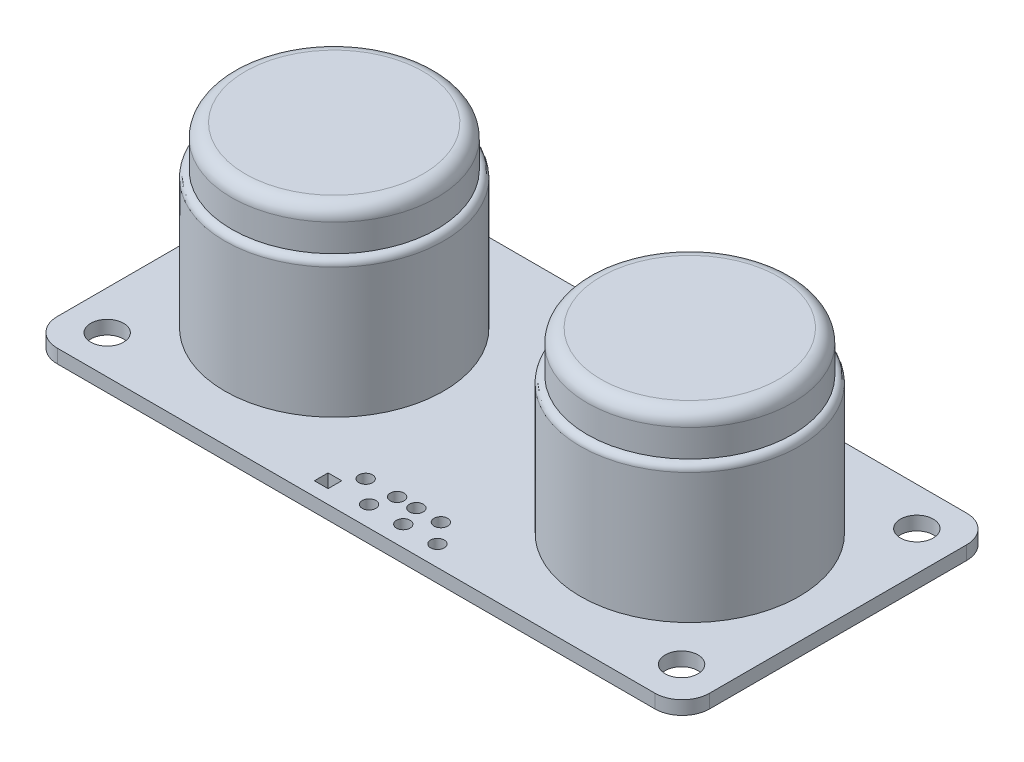
ISO-10303-21;
HEADER;
FILE_DESCRIPTION(('STEP AP214'),'2;1');
FILE_NAME('part.step','',(''),(''),'','','');
FILE_SCHEMA(('AUTOMOTIVE_DESIGN { 1 0 10303 214 1 1 1 1 }'));
ENDSEC;
DATA;
#1=APPLICATION_CONTEXT('core data for automotive mechanical design processes');
#2=APPLICATION_PROTOCOL_DEFINITION('international standard','automotive_design',2000,#1);
#3=PRODUCT_CONTEXT('',#1,'mechanical');
#4=PRODUCT('Part','Part','',(#3));
#5=PRODUCT_RELATED_PRODUCT_CATEGORY('part','',(#4));
#6=PRODUCT_DEFINITION_FORMATION('','',#4);
#7=PRODUCT_DEFINITION_CONTEXT('part definition',#1,'design');
#8=PRODUCT_DEFINITION('design','',#6,#7);
#9=PRODUCT_DEFINITION_SHAPE('','',#8);
#10=(LENGTH_UNIT() NAMED_UNIT(*) SI_UNIT(.MILLI.,.METRE.));
#11=(NAMED_UNIT(*) PLANE_ANGLE_UNIT() SI_UNIT($,.RADIAN.));
#12=(NAMED_UNIT(*) SI_UNIT($,.STERADIAN.) SOLID_ANGLE_UNIT());
#13=UNCERTAINTY_MEASURE_WITH_UNIT(LENGTH_MEASURE(1.E-05),#10,'distance_accuracy_value','');
#14=(GEOMETRIC_REPRESENTATION_CONTEXT(3) GLOBAL_UNCERTAINTY_ASSIGNED_CONTEXT((#13)) GLOBAL_UNIT_ASSIGNED_CONTEXT((#10,
#11,#12)) REPRESENTATION_CONTEXT('',''));
#15=CARTESIAN_POINT('',(0.,0.,0.));
#16=DIRECTION('',(0.,0.,1.));
#17=DIRECTION('',(1.,0.,0.));
#18=AXIS2_PLACEMENT_3D('',#15,#16,#17);
#19=CARTESIAN_POINT('',(0.,1.,0.));
#20=DIRECTION('',(0.,-1.,0.));
#21=DIRECTION('',(0.,0.,-1.));
#22=AXIS2_PLACEMENT_3D('',#19,#20,#21);
#23=PLANE('',#22);
#24=CARTESIAN_POINT('',(-21.,1.,-8.6));
#25=DIRECTION('',(0.,-1.,0.));
#26=DIRECTION('',(0.,0.,-1.));
#27=AXIS2_PLACEMENT_3D('',#24,#25,#26);
#28=CIRCLE('',#27,1.19999999999999);
#29=CARTESIAN_POINT('',(-21.,1.,-9.79999999999999));
#30=VERTEX_POINT('',#29);
#31=EDGE_CURVE('E649',#30,#30,#28,.T.);
#32=ORIENTED_EDGE('',*,*,#31,.T.);
#33=EDGE_LOOP('',(#32));
#34=FACE_BOUND('',#33,.T.);
#35=CARTESIAN_POINT('',(21.,1.,-8.6));
#36=DIRECTION('',(0.,-1.,0.));
#37=DIRECTION('',(0.,0.,-1.));
#38=AXIS2_PLACEMENT_3D('',#35,#36,#37);
#39=CIRCLE('',#38,1.19999999999999);
#40=CARTESIAN_POINT('',(21.,1.,-9.79999999999999));
#41=VERTEX_POINT('',#40);
#42=EDGE_CURVE('E653',#41,#41,#39,.T.);
#43=ORIENTED_EDGE('',*,*,#42,.T.);
#44=EDGE_LOOP('',(#43));
#45=FACE_BOUND('',#44,.T.);
#46=CARTESIAN_POINT('',(21.,1.,8.6));
#47=DIRECTION('',(0.,-1.,0.));
#48=DIRECTION('',(0.,0.,-1.));
#49=AXIS2_PLACEMENT_3D('',#46,#47,#48);
#50=CIRCLE('',#49,1.19999999999999);
#51=CARTESIAN_POINT('',(21.,1.,7.40000000000001));
#52=VERTEX_POINT('',#51);
#53=EDGE_CURVE('E201',#52,#52,#50,.T.);
#54=ORIENTED_EDGE('',*,*,#53,.T.);
#55=EDGE_LOOP('',(#54));
#56=FACE_BOUND('',#55,.T.);
#57=CARTESIAN_POINT('',(-21.,1.,8.6));
#58=DIRECTION('',(0.,-1.,0.));
#59=DIRECTION('',(0.,0.,-1.));
#60=AXIS2_PLACEMENT_3D('',#57,#58,#59);
#61=CIRCLE('',#60,1.19999999999999);
#62=CARTESIAN_POINT('',(-21.,1.,7.40000000000001));
#63=VERTEX_POINT('',#62);
#64=EDGE_CURVE('E663',#63,#63,#61,.T.);
#65=ORIENTED_EDGE('',*,*,#64,.T.);
#66=EDGE_LOOP('',(#65));
#67=FACE_BOUND('',#66,.T.);
#68=CARTESIAN_POINT('',(1.95,1.,9.9));
#69=DIRECTION('',(0.,1.,0.));
#70=DIRECTION('',(0.,0.,1.));
#71=AXIS2_PLACEMENT_3D('',#68,#69,#70);
#72=CIRCLE('',#71,0.499999999999988);
#73=CARTESIAN_POINT('',(1.95,1.,10.4));
#74=VERTEX_POINT('',#73);
#75=EDGE_CURVE('E672',#74,#74,#72,.T.);
#76=ORIENTED_EDGE('',*,*,#75,.F.);
#77=EDGE_LOOP('',(#76));
#78=FACE_BOUND('',#77,.T.);
#79=CARTESIAN_POINT('',(4.45,1.,9.9));
#80=DIRECTION('',(0.,1.,0.));
#81=DIRECTION('',(0.,0.,1.));
#82=AXIS2_PLACEMENT_3D('',#79,#80,#81);
#83=CIRCLE('',#82,0.499999999999988);
#84=CARTESIAN_POINT('',(4.45,1.,10.4));
#85=VERTEX_POINT('',#84);
#86=EDGE_CURVE('E678',#85,#85,#83,.T.);
#87=ORIENTED_EDGE('',*,*,#86,.F.);
#88=EDGE_LOOP('',(#87));
#89=FACE_BOUND('',#88,.T.);
#90=CARTESIAN_POINT('',(0.,1.,8.4));
#91=DIRECTION('',(0.,1.,0.));
#92=DIRECTION('',(0.,0.,1.));
#93=AXIS2_PLACEMENT_3D('',#90,#91,#92);
#94=CIRCLE('',#93,0.499999999999988);
#95=CARTESIAN_POINT('',(0.,1.,8.89999999999999));
#96=VERTEX_POINT('',#95);
#97=EDGE_CURVE('E690',#96,#96,#94,.T.);
#98=ORIENTED_EDGE('',*,*,#97,.F.);
#99=EDGE_LOOP('',(#98));
#100=FACE_BOUND('',#99,.T.);
#101=CARTESIAN_POINT('',(3.2,1.,8.4));
#102=DIRECTION('',(0.,1.,0.));
#103=DIRECTION('',(0.,0.,1.));
#104=AXIS2_PLACEMENT_3D('',#101,#102,#103);
#105=CIRCLE('',#104,0.499999999999988);
#106=CARTESIAN_POINT('',(3.2,1.,8.89999999999999));
#107=VERTEX_POINT('',#106);
#108=EDGE_CURVE('E696',#107,#107,#105,.T.);
#109=ORIENTED_EDGE('',*,*,#108,.F.);
#110=EDGE_LOOP('',(#109));
#111=FACE_BOUND('',#110,.T.);
#112=CARTESIAN_POINT('',(1.407287445354,1.,8.4));
#113=DIRECTION('',(0.,1.,0.));
#114=DIRECTION('',(0.,0.,1.));
#115=AXIS2_PLACEMENT_3D('',#112,#113,#114);
#116=CIRCLE('',#115,0.499999999999988);
#117=CARTESIAN_POINT('',(1.407287445354,1.,8.89999999999999));
#118=VERTEX_POINT('',#117);
#119=EDGE_CURVE('E702',#118,#118,#116,.T.);
#120=ORIENTED_EDGE('',*,*,#119,.F.);
#121=EDGE_LOOP('',(#120));
#122=FACE_BOUND('',#121,.T.);
#123=CARTESIAN_POINT('',(-13.,1.,0.));
#124=DIRECTION('',(0.,1.,0.));
#125=DIRECTION('',(0.,0.,1.));
#126=AXIS2_PLACEMENT_3D('',#123,#124,#125);
#127=CIRCLE('',#126,8.);
#128=CARTESIAN_POINT('',(-13.,1.,8.));
#129=VERTEX_POINT('',#128);
#130=EDGE_CURVE('E714',#129,#129,#127,.T.);
#131=ORIENTED_EDGE('',*,*,#130,.F.);
#132=EDGE_LOOP('',(#131));
#133=FACE_BOUND('',#132,.T.);
#134=CARTESIAN_POINT('',(13.,1.,0.));
#135=DIRECTION('',(0.,1.,0.));
#136=DIRECTION('',(0.,0.,1.));
#137=AXIS2_PLACEMENT_3D('',#134,#135,#136);
#138=CIRCLE('',#137,8.);
#139=CARTESIAN_POINT('',(13.,1.,8.));
#140=VERTEX_POINT('',#139);
#141=EDGE_CURVE('E162',#140,#140,#138,.T.);
#142=ORIENTED_EDGE('',*,*,#141,.F.);
#143=EDGE_LOOP('',(#142));
#144=FACE_BOUND('',#143,.T.);
#145=DIRECTION('',(0.,0.,1.));
#146=VECTOR('',#145,1.);
#147=CARTESIAN_POINT('',(-4.05,1.,9.4));
#148=LINE('',#147,#146);
#149=CARTESIAN_POINT('',(-4.05,1.,9.4));
#150=VERTEX_POINT('',#149);
#151=CARTESIAN_POINT('',(-4.05,1.,10.4));
#152=VERTEX_POINT('',#151);
#153=EDGE_CURVE('E168',#150,#152,#148,.T.);
#154=ORIENTED_EDGE('',*,*,#153,.F.);
#155=DIRECTION('',(-1.,0.,0.));
#156=VECTOR('',#155,1.);
#157=CARTESIAN_POINT('',(-3.05,1.,9.4));
#158=LINE('',#157,#156);
#159=CARTESIAN_POINT('',(-3.05,1.,9.4));
#160=VERTEX_POINT('',#159);
#161=EDGE_CURVE('E138',#160,#150,#158,.T.);
#162=ORIENTED_EDGE('',*,*,#161,.F.);
#163=DIRECTION('',(0.,0.,-1.));
#164=VECTOR('',#163,1.);
#165=CARTESIAN_POINT('',(-3.05,1.,10.4));
#166=LINE('',#165,#164);
#167=CARTESIAN_POINT('',(-3.05,1.,10.4));
#168=VERTEX_POINT('',#167);
#169=EDGE_CURVE('E156',#168,#160,#166,.T.);
#170=ORIENTED_EDGE('',*,*,#169,.F.);
#171=DIRECTION('',(1.,0.,0.));
#172=VECTOR('',#171,1.);
#173=CARTESIAN_POINT('',(-4.05,1.,10.4));
#174=LINE('',#173,#172);
#175=EDGE_CURVE('E159',#152,#168,#174,.T.);
#176=ORIENTED_EDGE('',*,*,#175,.F.);
#177=EDGE_LOOP('',(#154,#162,#170,#176));
#178=FACE_BOUND('',#177,.T.);
#179=DIRECTION('',(1.,0.,0.));
#180=VECTOR('',#179,1.);
#181=CARTESIAN_POINT('',(-23.85,1.,-11.4));
#182=LINE('',#181,#180);
#183=CARTESIAN_POINT('',(-21.85,1.,-11.4));
#184=VERTEX_POINT('',#183);
#185=CARTESIAN_POINT('',(21.85,1.,-11.4));
#186=VERTEX_POINT('',#185);
#187=EDGE_CURVE('E181',#184,#186,#182,.T.);
#188=ORIENTED_EDGE('',*,*,#187,.F.);
#189=CARTESIAN_POINT('',(-21.85,1.,-9.4));
#190=DIRECTION('',(0.,-1.,0.));
#191=DIRECTION('',(0.,0.,-1.));
#192=AXIS2_PLACEMENT_3D('',#189,#190,#191);
#193=CIRCLE('',#192,2.);
#194=CARTESIAN_POINT('',(-23.85,1.,-9.4));
#195=VERTEX_POINT('',#194);
#196=EDGE_CURVE('E240',#184,#195,#193,.F.);
#197=ORIENTED_EDGE('',*,*,#196,.T.);
#198=DIRECTION('',(0.,0.,-1.));
#199=VECTOR('',#198,1.);
#200=CARTESIAN_POINT('',(-23.85,1.,11.4));
#201=LINE('',#200,#199);
#202=CARTESIAN_POINT('',(-23.85,1.,9.4));
#203=VERTEX_POINT('',#202);
#204=EDGE_CURVE('E178',#203,#195,#201,.T.);
#205=ORIENTED_EDGE('',*,*,#204,.F.);
#206=CARTESIAN_POINT('',(-21.85,1.,9.4));
#207=DIRECTION('',(0.,-1.,0.));
#208=DIRECTION('',(0.,0.,-1.));
#209=AXIS2_PLACEMENT_3D('',#206,#207,#208);
#210=CIRCLE('',#209,2.);
#211=CARTESIAN_POINT('',(-21.85,1.,11.4));
#212=VERTEX_POINT('',#211);
#213=EDGE_CURVE('E235',#203,#212,#210,.F.);
#214=ORIENTED_EDGE('',*,*,#213,.T.);
#215=DIRECTION('',(-1.,0.,0.));
#216=VECTOR('',#215,1.);
#217=CARTESIAN_POINT('',(23.85,1.,11.4));
#218=LINE('',#217,#216);
#219=CARTESIAN_POINT('',(21.85,1.,11.4));
#220=VERTEX_POINT('',#219);
#221=EDGE_CURVE('E187',#220,#212,#218,.T.);
#222=ORIENTED_EDGE('',*,*,#221,.F.);
#223=CARTESIAN_POINT('',(21.85,1.,9.4));
#224=DIRECTION('',(0.,-1.,0.));
#225=DIRECTION('',(0.,0.,-1.));
#226=AXIS2_PLACEMENT_3D('',#223,#224,#225);
#227=CIRCLE('',#226,2.);
#228=CARTESIAN_POINT('',(23.85,1.,9.4));
#229=VERTEX_POINT('',#228);
#230=EDGE_CURVE('E56',#220,#229,#227,.F.);
#231=ORIENTED_EDGE('',*,*,#230,.T.);
#232=DIRECTION('',(0.,0.,1.));
#233=VECTOR('',#232,1.);
#234=CARTESIAN_POINT('',(23.85,1.,-11.4));
#235=LINE('',#234,#233);
#236=CARTESIAN_POINT('',(23.85,1.,-9.4));
#237=VERTEX_POINT('',#236);
#238=EDGE_CURVE('E185',#237,#229,#235,.T.);
#239=ORIENTED_EDGE('',*,*,#238,.F.);
#240=CARTESIAN_POINT('',(21.85,1.,-9.4));
#241=DIRECTION('',(0.,-1.,0.));
#242=DIRECTION('',(0.,0.,-1.));
#243=AXIS2_PLACEMENT_3D('',#240,#241,#242);
#244=CIRCLE('',#243,2.);
#245=EDGE_CURVE('E237',#237,#186,#244,.F.);
#246=ORIENTED_EDGE('',*,*,#245,.T.);
#247=EDGE_LOOP('',(#188,#197,#205,#214,#222,#231,#239,#246));
#248=FACE_BOUND('',#247,.T.);
#249=CARTESIAN_POINT('',(-2.3,1.,8.4));
#250=DIRECTION('',(0.,1.,0.));
#251=DIRECTION('',(0.,0.,1.));
#252=AXIS2_PLACEMENT_3D('',#249,#250,#251);
#253=CIRCLE('',#252,0.499999999999988);
#254=CARTESIAN_POINT('',(-2.3,1.,8.89999999999999));
#255=VERTEX_POINT('',#254);
#256=EDGE_CURVE('E684',#255,#255,#253,.T.);
#257=ORIENTED_EDGE('',*,*,#256,.F.);
#258=EDGE_LOOP('',(#257));
#259=FACE_BOUND('',#258,.T.);
#260=CARTESIAN_POINT('',(-0.55,1.,9.9));
#261=DIRECTION('',(0.,1.,0.));
#262=DIRECTION('',(0.,0.,1.));
#263=AXIS2_PLACEMENT_3D('',#260,#261,#262);
#264=CIRCLE('',#263,0.499999999999988);
#265=CARTESIAN_POINT('',(-0.55,1.,10.4));
#266=VERTEX_POINT('',#265);
#267=EDGE_CURVE('E666',#266,#266,#264,.T.);
#268=ORIENTED_EDGE('',*,*,#267,.F.);
#269=EDGE_LOOP('',(#268));
#270=FACE_BOUND('',#269,.T.);
#271=ADVANCED_FACE('F41',(#34,#45,#56,#67,#78,#89,#100,#111,#122,#133,#144,#178,#248,#259,#270),
#23,.F.);
#272=CARTESIAN_POINT('',(0.,0.,0.));
#273=DIRECTION('',(0.,-1.,0.));
#274=DIRECTION('',(0.,0.,-1.));
#275=AXIS2_PLACEMENT_3D('',#272,#273,#274);
#276=PLANE('',#275);
#277=CARTESIAN_POINT('',(-21.,0.,-8.6));
#278=DIRECTION('',(0.,-1.,0.));
#279=DIRECTION('',(0.,0.,-1.));
#280=AXIS2_PLACEMENT_3D('',#277,#278,#279);
#281=CIRCLE('',#280,1.19999999999999);
#282=CARTESIAN_POINT('',(-21.,0.,-9.79999999999999));
#283=VERTEX_POINT('',#282);
#284=EDGE_CURVE('E647',#283,#283,#281,.T.);
#285=ORIENTED_EDGE('',*,*,#284,.F.);
#286=EDGE_LOOP('',(#285));
#287=FACE_BOUND('',#286,.T.);
#288=CARTESIAN_POINT('',(21.,0.,-8.6));
#289=DIRECTION('',(0.,-1.,0.));
#290=DIRECTION('',(0.,0.,-1.));
#291=AXIS2_PLACEMENT_3D('',#288,#289,#290);
#292=CIRCLE('',#291,1.19999999999999);
#293=CARTESIAN_POINT('',(21.,0.,-9.79999999999999));
#294=VERTEX_POINT('',#293);
#295=EDGE_CURVE('E650',#294,#294,#292,.T.);
#296=ORIENTED_EDGE('',*,*,#295,.F.);
#297=EDGE_LOOP('',(#296));
#298=FACE_BOUND('',#297,.T.);
#299=CARTESIAN_POINT('',(21.,0.,8.6));
#300=DIRECTION('',(0.,-1.,0.));
#301=DIRECTION('',(0.,0.,-1.));
#302=AXIS2_PLACEMENT_3D('',#299,#300,#301);
#303=CIRCLE('',#302,1.19999999999999);
#304=CARTESIAN_POINT('',(21.,0.,7.40000000000001));
#305=VERTEX_POINT('',#304);
#306=EDGE_CURVE('E205',#305,#305,#303,.T.);
#307=ORIENTED_EDGE('',*,*,#306,.F.);
#308=EDGE_LOOP('',(#307));
#309=FACE_BOUND('',#308,.T.);
#310=CARTESIAN_POINT('',(-21.,0.,8.6));
#311=DIRECTION('',(0.,-1.,0.));
#312=DIRECTION('',(0.,0.,-1.));
#313=AXIS2_PLACEMENT_3D('',#310,#311,#312);
#314=CIRCLE('',#313,1.19999999999999);
#315=CARTESIAN_POINT('',(-21.,0.,7.40000000000001));
#316=VERTEX_POINT('',#315);
#317=EDGE_CURVE('E204',#316,#316,#314,.T.);
#318=ORIENTED_EDGE('',*,*,#317,.F.);
#319=EDGE_LOOP('',(#318));
#320=FACE_BOUND('',#319,.T.);
#321=CARTESIAN_POINT('',(-0.55,0.,9.9));
#322=DIRECTION('',(0.,1.,0.));
#323=DIRECTION('',(0.,0.,1.));
#324=AXIS2_PLACEMENT_3D('',#321,#322,#323);
#325=CIRCLE('',#324,0.499999999999988);
#326=CARTESIAN_POINT('',(-0.55,0.,10.4));
#327=VERTEX_POINT('',#326);
#328=EDGE_CURVE('E669',#327,#327,#325,.T.);
#329=ORIENTED_EDGE('',*,*,#328,.T.);
#330=EDGE_LOOP('',(#329));
#331=FACE_BOUND('',#330,.T.);
#332=CARTESIAN_POINT('',(1.95,0.,9.9));
#333=DIRECTION('',(0.,1.,0.));
#334=DIRECTION('',(0.,0.,1.));
#335=AXIS2_PLACEMENT_3D('',#332,#333,#334);
#336=CIRCLE('',#335,0.499999999999987);
#337=CARTESIAN_POINT('',(1.95,0.,10.4));
#338=VERTEX_POINT('',#337);
#339=EDGE_CURVE('E675',#338,#338,#336,.T.);
#340=ORIENTED_EDGE('',*,*,#339,.T.);
#341=EDGE_LOOP('',(#340));
#342=FACE_BOUND('',#341,.T.);
#343=CARTESIAN_POINT('',(4.45,0.,9.9));
#344=DIRECTION('',(0.,1.,0.));
#345=DIRECTION('',(0.,0.,1.));
#346=AXIS2_PLACEMENT_3D('',#343,#344,#345);
#347=CIRCLE('',#346,0.499999999999987);
#348=CARTESIAN_POINT('',(4.45,0.,10.4));
#349=VERTEX_POINT('',#348);
#350=EDGE_CURVE('E681',#349,#349,#347,.T.);
#351=ORIENTED_EDGE('',*,*,#350,.T.);
#352=EDGE_LOOP('',(#351));
#353=FACE_BOUND('',#352,.T.);
#354=CARTESIAN_POINT('',(-2.3,0.,8.4));
#355=DIRECTION('',(0.,1.,0.));
#356=DIRECTION('',(0.,0.,1.));
#357=AXIS2_PLACEMENT_3D('',#354,#355,#356);
#358=CIRCLE('',#357,0.499999999999987);
#359=CARTESIAN_POINT('',(-2.3,0.,8.89999999999999));
#360=VERTEX_POINT('',#359);
#361=EDGE_CURVE('E687',#360,#360,#358,.T.);
#362=ORIENTED_EDGE('',*,*,#361,.T.);
#363=EDGE_LOOP('',(#362));
#364=FACE_BOUND('',#363,.T.);
#365=DIRECTION('',(0.,0.,-1.));
#366=VECTOR('',#365,1.);
#367=CARTESIAN_POINT('',(-23.85,0.,11.4));
#368=LINE('',#367,#366);
#369=CARTESIAN_POINT('',(-23.85,0.,9.4));
#370=VERTEX_POINT('',#369);
#371=CARTESIAN_POINT('',(-23.85,0.,-9.4));
#372=VERTEX_POINT('',#371);
#373=EDGE_CURVE('E174',#370,#372,#368,.T.);
#374=ORIENTED_EDGE('',*,*,#373,.T.);
#375=CARTESIAN_POINT('',(-21.85,0.,-9.4));
#376=DIRECTION('',(0.,-1.,0.));
#377=DIRECTION('',(0.,0.,-1.));
#378=AXIS2_PLACEMENT_3D('',#375,#376,#377);
#379=CIRCLE('',#378,2.);
#380=CARTESIAN_POINT('',(-21.85,0.,-11.4));
#381=VERTEX_POINT('',#380);
#382=EDGE_CURVE('E228',#372,#381,#379,.T.);
#383=ORIENTED_EDGE('',*,*,#382,.T.);
#384=DIRECTION('',(1.,0.,0.));
#385=VECTOR('',#384,1.);
#386=CARTESIAN_POINT('',(-23.85,0.,-11.4));
#387=LINE('',#386,#385);
#388=CARTESIAN_POINT('',(21.85,0.,-11.4));
#389=VERTEX_POINT('',#388);
#390=EDGE_CURVE('E193',#381,#389,#387,.T.);
#391=ORIENTED_EDGE('',*,*,#390,.T.);
#392=CARTESIAN_POINT('',(21.85,0.,-9.4));
#393=DIRECTION('',(0.,-1.,0.));
#394=DIRECTION('',(0.,0.,-1.));
#395=AXIS2_PLACEMENT_3D('',#392,#393,#394);
#396=CIRCLE('',#395,2.);
#397=CARTESIAN_POINT('',(23.85,0.,-9.4));
#398=VERTEX_POINT('',#397);
#399=EDGE_CURVE('E224',#389,#398,#396,.T.);
#400=ORIENTED_EDGE('',*,*,#399,.T.);
#401=DIRECTION('',(0.,0.,1.));
#402=VECTOR('',#401,1.);
#403=CARTESIAN_POINT('',(23.85,0.,-11.4));
#404=LINE('',#403,#402);
#405=CARTESIAN_POINT('',(23.85,0.,9.4));
#406=VERTEX_POINT('',#405);
#407=EDGE_CURVE('E196',#398,#406,#404,.T.);
#408=ORIENTED_EDGE('',*,*,#407,.T.);
#409=CARTESIAN_POINT('',(21.85,0.,9.4));
#410=DIRECTION('',(0.,-1.,0.));
#411=DIRECTION('',(0.,0.,-1.));
#412=AXIS2_PLACEMENT_3D('',#409,#410,#411);
#413=CIRCLE('',#412,2.);
#414=CARTESIAN_POINT('',(21.85,0.,11.4));
#415=VERTEX_POINT('',#414);
#416=EDGE_CURVE('E226',#406,#415,#413,.T.);
#417=ORIENTED_EDGE('',*,*,#416,.T.);
#418=DIRECTION('',(-1.,0.,0.));
#419=VECTOR('',#418,1.);
#420=CARTESIAN_POINT('',(23.85,0.,11.4));
#421=LINE('',#420,#419);
#422=CARTESIAN_POINT('',(-21.85,0.,11.4));
#423=VERTEX_POINT('',#422);
#424=EDGE_CURVE('E182',#415,#423,#421,.T.);
#425=ORIENTED_EDGE('',*,*,#424,.T.);
#426=CARTESIAN_POINT('',(-21.85,0.,9.4));
#427=DIRECTION('',(0.,-1.,0.));
#428=DIRECTION('',(0.,0.,-1.));
#429=AXIS2_PLACEMENT_3D('',#426,#427,#428);
#430=CIRCLE('',#429,2.);
#431=EDGE_CURVE('E222',#423,#370,#430,.T.);
#432=ORIENTED_EDGE('',*,*,#431,.T.);
#433=EDGE_LOOP('',(#374,#383,#391,#400,#408,#417,#425,#432));
#434=FACE_BOUND('',#433,.T.);
#435=DIRECTION('',(-1.,0.,0.));
#436=VECTOR('',#435,1.);
#437=CARTESIAN_POINT('',(-3.05,0.,9.4));
#438=LINE('',#437,#436);
#439=CARTESIAN_POINT('',(-3.05,0.,9.4));
#440=VERTEX_POINT('',#439);
#441=CARTESIAN_POINT('',(-4.05,0.,9.4));
#442=VERTEX_POINT('',#441);
#443=EDGE_CURVE('E135',#440,#442,#438,.T.);
#444=ORIENTED_EDGE('',*,*,#443,.T.);
#445=DIRECTION('',(0.,0.,1.));
#446=VECTOR('',#445,1.);
#447=CARTESIAN_POINT('',(-4.05,0.,9.4));
#448=LINE('',#447,#446);
#449=CARTESIAN_POINT('',(-4.05,0.,10.4));
#450=VERTEX_POINT('',#449);
#451=EDGE_CURVE('E147',#442,#450,#448,.T.);
#452=ORIENTED_EDGE('',*,*,#451,.T.);
#453=DIRECTION('',(1.,0.,0.));
#454=VECTOR('',#453,1.);
#455=CARTESIAN_POINT('',(-4.05,0.,10.4));
#456=LINE('',#455,#454);
#457=CARTESIAN_POINT('',(-3.05,0.,10.4));
#458=VERTEX_POINT('',#457);
#459=EDGE_CURVE('E151',#450,#458,#456,.T.);
#460=ORIENTED_EDGE('',*,*,#459,.T.);
#461=DIRECTION('',(0.,0.,-1.));
#462=VECTOR('',#461,1.);
#463=CARTESIAN_POINT('',(-3.05,0.,10.4));
#464=LINE('',#463,#462);
#465=EDGE_CURVE('E143',#458,#440,#464,.T.);
#466=ORIENTED_EDGE('',*,*,#465,.T.);
#467=EDGE_LOOP('',(#444,#452,#460,#466));
#468=FACE_BOUND('',#467,.T.);
#469=CARTESIAN_POINT('',(1.407287445354,0.,8.4));
#470=DIRECTION('',(0.,1.,0.));
#471=DIRECTION('',(0.,0.,1.));
#472=AXIS2_PLACEMENT_3D('',#469,#470,#471);
#473=CIRCLE('',#472,0.499999999999988);
#474=CARTESIAN_POINT('',(1.407287445354,0.,8.89999999999999));
#475=VERTEX_POINT('',#474);
#476=EDGE_CURVE('E705',#475,#475,#473,.T.);
#477=ORIENTED_EDGE('',*,*,#476,.T.);
#478=EDGE_LOOP('',(#477));
#479=FACE_BOUND('',#478,.T.);
#480=CARTESIAN_POINT('',(3.2,0.,8.4));
#481=DIRECTION('',(0.,1.,0.));
#482=DIRECTION('',(0.,0.,1.));
#483=AXIS2_PLACEMENT_3D('',#480,#481,#482);
#484=CIRCLE('',#483,0.499999999999987);
#485=CARTESIAN_POINT('',(3.2,0.,8.89999999999999));
#486=VERTEX_POINT('',#485);
#487=EDGE_CURVE('E699',#486,#486,#484,.T.);
#488=ORIENTED_EDGE('',*,*,#487,.T.);
#489=EDGE_LOOP('',(#488));
#490=FACE_BOUND('',#489,.T.);
#491=CARTESIAN_POINT('',(0.,0.,8.4));
#492=DIRECTION('',(0.,1.,0.));
#493=DIRECTION('',(0.,0.,1.));
#494=AXIS2_PLACEMENT_3D('',#491,#492,#493);
#495=CIRCLE('',#494,0.499999999999988);
#496=CARTESIAN_POINT('',(0.,0.,8.89999999999999));
#497=VERTEX_POINT('',#496);
#498=EDGE_CURVE('E693',#497,#497,#495,.T.);
#499=ORIENTED_EDGE('',*,*,#498,.T.);
#500=EDGE_LOOP('',(#499));
#501=FACE_BOUND('',#500,.T.);
#502=ADVANCED_FACE('F153',(#287,#298,#309,#320,#331,#342,#353,#364,#434,#468,#479,#490,#501),
#276,.T.);
#503=CARTESIAN_POINT('',(-23.85,1.,11.4));
#504=DIRECTION('',(-1.,0.,0.));
#505=DIRECTION('',(0.,0.,1.));
#506=AXIS2_PLACEMENT_3D('',#503,#504,#505);
#507=PLANE('',#506);
#508=ORIENTED_EDGE('',*,*,#204,.T.);
#509=DIRECTION('',(0.,-1.,0.));
#510=VECTOR('',#509,1.);
#511=CARTESIAN_POINT('',(-23.85,1.,-9.4));
#512=LINE('',#511,#510);
#513=EDGE_CURVE('E219',#195,#372,#512,.T.);
#514=ORIENTED_EDGE('',*,*,#513,.T.);
#515=ORIENTED_EDGE('',*,*,#373,.F.);
#516=DIRECTION('',(0.,-1.,0.));
#517=VECTOR('',#516,1.);
#518=CARTESIAN_POINT('',(-23.85,1.,9.4));
#519=LINE('',#518,#517);
#520=EDGE_CURVE('E217',#370,#203,#519,.F.);
#521=ORIENTED_EDGE('',*,*,#520,.T.);
#522=EDGE_LOOP('',(#508,#514,#515,#521));
#523=FACE_BOUND('',#522,.T.);
#524=ADVANCED_FACE('F274',(#523),#507,.T.);
#525=CARTESIAN_POINT('',(23.85,1.,11.4));
#526=DIRECTION('',(0.,0.,1.));
#527=DIRECTION('',(1.,0.,0.));
#528=AXIS2_PLACEMENT_3D('',#525,#526,#527);
#529=PLANE('',#528);
#530=ORIENTED_EDGE('',*,*,#424,.F.);
#531=DIRECTION('',(0.,-1.,0.));
#532=VECTOR('',#531,1.);
#533=CARTESIAN_POINT('',(21.85,1.,11.4));
#534=LINE('',#533,#532);
#535=EDGE_CURVE('E11',#415,#220,#534,.F.);
#536=ORIENTED_EDGE('',*,*,#535,.T.);
#537=ORIENTED_EDGE('',*,*,#221,.T.);
#538=DIRECTION('',(0.,-1.,0.));
#539=VECTOR('',#538,1.);
#540=CARTESIAN_POINT('',(-21.85,1.,11.4));
#541=LINE('',#540,#539);
#542=EDGE_CURVE('E49',#212,#423,#541,.T.);
#543=ORIENTED_EDGE('',*,*,#542,.T.);
#544=EDGE_LOOP('',(#530,#536,#537,#543));
#545=FACE_BOUND('',#544,.T.);
#546=ADVANCED_FACE('F249',(#545),#529,.T.);
#547=CARTESIAN_POINT('',(23.85,1.,-11.4));
#548=DIRECTION('',(1.,0.,0.));
#549=DIRECTION('',(0.,0.,-1.));
#550=AXIS2_PLACEMENT_3D('',#547,#548,#549);
#551=PLANE('',#550);
#552=ORIENTED_EDGE('',*,*,#238,.T.);
#553=DIRECTION('',(0.,-1.,0.));
#554=VECTOR('',#553,1.);
#555=CARTESIAN_POINT('',(23.85,1.,9.4));
#556=LINE('',#555,#554);
#557=EDGE_CURVE('E243',#229,#406,#556,.T.);
#558=ORIENTED_EDGE('',*,*,#557,.T.);
#559=ORIENTED_EDGE('',*,*,#407,.F.);
#560=DIRECTION('',(0.,-1.,0.));
#561=VECTOR('',#560,1.);
#562=CARTESIAN_POINT('',(23.85,1.,-9.4));
#563=LINE('',#562,#561);
#564=EDGE_CURVE('E63',#398,#237,#563,.F.);
#565=ORIENTED_EDGE('',*,*,#564,.T.);
#566=EDGE_LOOP('',(#552,#558,#559,#565));
#567=FACE_BOUND('',#566,.T.);
#568=ADVANCED_FACE('F258',(#567),#551,.T.);
#569=CARTESIAN_POINT('',(-23.85,1.,-11.4));
#570=DIRECTION('',(0.,0.,-1.));
#571=DIRECTION('',(-1.,0.,0.));
#572=AXIS2_PLACEMENT_3D('',#569,#570,#571);
#573=PLANE('',#572);
#574=ORIENTED_EDGE('',*,*,#390,.F.);
#575=DIRECTION('',(0.,-1.,0.));
#576=VECTOR('',#575,1.);
#577=CARTESIAN_POINT('',(-21.85,1.,-11.4));
#578=LINE('',#577,#576);
#579=EDGE_CURVE('E233',#381,#184,#578,.F.);
#580=ORIENTED_EDGE('',*,*,#579,.T.);
#581=ORIENTED_EDGE('',*,*,#187,.T.);
#582=DIRECTION('',(0.,-1.,0.));
#583=VECTOR('',#582,1.);
#584=CARTESIAN_POINT('',(21.85,1.,-11.4));
#585=LINE('',#584,#583);
#586=EDGE_CURVE('E230',#186,#389,#585,.T.);
#587=ORIENTED_EDGE('',*,*,#586,.T.);
#588=EDGE_LOOP('',(#574,#580,#581,#587));
#589=FACE_BOUND('',#588,.T.);
#590=ADVANCED_FACE('F267',(#589),#573,.T.);
#591=CARTESIAN_POINT('',(-3.05,0.,9.4));
#592=DIRECTION('',(0.,0.,-1.));
#593=DIRECTION('',(-1.,0.,0.));
#594=AXIS2_PLACEMENT_3D('',#591,#592,#593);
#595=PLANE('',#594);
#596=ORIENTED_EDGE('',*,*,#161,.T.);
#597=DIRECTION('',(0.,1.,0.));
#598=VECTOR('',#597,1.);
#599=CARTESIAN_POINT('',(-4.05,0.,9.4));
#600=LINE('',#599,#598);
#601=EDGE_CURVE('E131',#442,#150,#600,.T.);
#602=ORIENTED_EDGE('',*,*,#601,.F.);
#603=ORIENTED_EDGE('',*,*,#443,.F.);
#604=DIRECTION('',(0.,1.,0.));
#605=VECTOR('',#604,1.);
#606=CARTESIAN_POINT('',(-3.05,0.,9.4));
#607=LINE('',#606,#605);
#608=EDGE_CURVE('E172',#440,#160,#607,.T.);
#609=ORIENTED_EDGE('',*,*,#608,.T.);
#610=EDGE_LOOP('',(#596,#602,#603,#609));
#611=FACE_BOUND('',#610,.T.);
#612=ADVANCED_FACE('F133',(#611),#595,.F.);
#613=CARTESIAN_POINT('',(-3.05,0.,10.4));
#614=DIRECTION('',(1.,0.,0.));
#615=DIRECTION('',(0.,0.,-1.));
#616=AXIS2_PLACEMENT_3D('',#613,#614,#615);
#617=PLANE('',#616);
#618=ORIENTED_EDGE('',*,*,#169,.T.);
#619=ORIENTED_EDGE('',*,*,#608,.F.);
#620=ORIENTED_EDGE('',*,*,#465,.F.);
#621=DIRECTION('',(0.,1.,0.));
#622=VECTOR('',#621,1.);
#623=CARTESIAN_POINT('',(-3.05,0.,10.4));
#624=LINE('',#623,#622);
#625=EDGE_CURVE('E175',#458,#168,#624,.T.);
#626=ORIENTED_EDGE('',*,*,#625,.T.);
#627=EDGE_LOOP('',(#618,#619,#620,#626));
#628=FACE_BOUND('',#627,.T.);
#629=ADVANCED_FACE('F495',(#628),#617,.F.);
#630=CARTESIAN_POINT('',(-4.05,0.,10.4));
#631=DIRECTION('',(0.,0.,1.));
#632=DIRECTION('',(1.,0.,0.));
#633=AXIS2_PLACEMENT_3D('',#630,#631,#632);
#634=PLANE('',#633);
#635=ORIENTED_EDGE('',*,*,#175,.T.);
#636=ORIENTED_EDGE('',*,*,#625,.F.);
#637=ORIENTED_EDGE('',*,*,#459,.F.);
#638=DIRECTION('',(0.,1.,0.));
#639=VECTOR('',#638,1.);
#640=CARTESIAN_POINT('',(-4.05,0.,10.4));
#641=LINE('',#640,#639);
#642=EDGE_CURVE('E142',#450,#152,#641,.T.);
#643=ORIENTED_EDGE('',*,*,#642,.T.);
#644=EDGE_LOOP('',(#635,#636,#637,#643));
#645=FACE_BOUND('',#644,.T.);
#646=ADVANCED_FACE('F490',(#645),#634,.F.);
#647=CARTESIAN_POINT('',(-4.05,0.,9.4));
#648=DIRECTION('',(-1.,0.,0.));
#649=DIRECTION('',(0.,0.,1.));
#650=AXIS2_PLACEMENT_3D('',#647,#648,#649);
#651=PLANE('',#650);
#652=ORIENTED_EDGE('',*,*,#153,.T.);
#653=ORIENTED_EDGE('',*,*,#642,.F.);
#654=ORIENTED_EDGE('',*,*,#451,.F.);
#655=ORIENTED_EDGE('',*,*,#601,.T.);
#656=EDGE_LOOP('',(#652,#653,#654,#655));
#657=FACE_BOUND('',#656,.T.);
#658=ADVANCED_FACE('F148',(#657),#651,.F.);
#659=CARTESIAN_POINT('',(13.,1.,0.));
#660=DIRECTION('',(0.,1.,0.));
#661=DIRECTION('',(0.,0.,1.));
#662=AXIS2_PLACEMENT_3D('',#659,#660,#661);
#663=CYLINDRICAL_SURFACE('',#662,8.);
#664=ORIENTED_EDGE('',*,*,#141,.T.);
#665=EDGE_LOOP('',(#664));
#666=FACE_BOUND('',#665,.T.);
#667=CARTESIAN_POINT('',(13.,10.5,0.));
#668=DIRECTION('',(0.,1.,0.));
#669=DIRECTION('',(0.,0.,1.));
#670=AXIS2_PLACEMENT_3D('',#667,#668,#669);
#671=CIRCLE('',#670,8.);
#672=CARTESIAN_POINT('',(13.,10.5,8.));
#673=VERTEX_POINT('',#672);
#674=EDGE_CURVE('E717',#673,#673,#671,.T.);
#675=ORIENTED_EDGE('',*,*,#674,.F.);
#676=EDGE_LOOP('',(#675));
#677=FACE_BOUND('',#676,.T.);
#678=ADVANCED_FACE('F475',(#666,#677),#663,.T.);
#679=CARTESIAN_POINT('',(13.,14.,0.));
#680=DIRECTION('',(0.,1.,0.));
#681=DIRECTION('',(0.,0.,1.));
#682=AXIS2_PLACEMENT_3D('',#679,#680,#681);
#683=PLANE('',#682);
#684=CARTESIAN_POINT('',(13.,14.,0.));
#685=DIRECTION('',(0.,1.,0.));
#686=DIRECTION('',(0.,0.,1.));
#687=AXIS2_PLACEMENT_3D('',#684,#685,#686);
#688=CIRCLE('',#687,6.5);
#689=CARTESIAN_POINT('',(13.,14.,6.5));
#690=VERTEX_POINT('',#689);
#691=EDGE_CURVE('E190',#690,#690,#688,.T.);
#692=ORIENTED_EDGE('',*,*,#691,.T.);
#693=EDGE_LOOP('',(#692));
#694=FACE_BOUND('',#693,.T.);
#695=ADVANCED_FACE('F467',(#694),#683,.T.);
#696=CARTESIAN_POINT('',(13.,1.,0.));
#697=DIRECTION('',(0.,1.,0.));
#698=DIRECTION('',(0.,0.,1.));
#699=AXIS2_PLACEMENT_3D('',#696,#697,#698);
#700=CYLINDRICAL_SURFACE('',#699,7.5);
#701=CARTESIAN_POINT('',(13.,13.,0.));
#702=DIRECTION('',(0.,1.,0.));
#703=DIRECTION('',(0.,0.,1.));
#704=AXIS2_PLACEMENT_3D('',#701,#702,#703);
#705=CIRCLE('',#704,7.5);
#706=CARTESIAN_POINT('',(13.,13.,7.5));
#707=VERTEX_POINT('',#706);
#708=EDGE_CURVE('E208',#707,#707,#705,.F.);
#709=ORIENTED_EDGE('',*,*,#708,.T.);
#710=EDGE_LOOP('',(#709));
#711=FACE_BOUND('',#710,.T.);
#712=CARTESIAN_POINT('',(13.,11.,0.));
#713=DIRECTION('',(0.,1.,0.));
#714=DIRECTION('',(0.,0.,1.));
#715=AXIS2_PLACEMENT_3D('',#712,#713,#714);
#716=CIRCLE('',#715,7.5);
#717=CARTESIAN_POINT('',(13.,11.,7.5));
#718=VERTEX_POINT('',#717);
#719=EDGE_CURVE('E719',#718,#718,#716,.T.);
#720=ORIENTED_EDGE('',*,*,#719,.T.);
#721=EDGE_LOOP('',(#720));
#722=FACE_BOUND('',#721,.T.);
#723=ADVANCED_FACE('F459',(#711,#722),#700,.T.);
#724=CARTESIAN_POINT('',(13.,10.5,0.));
#725=DIRECTION('',(0.,1.,0.));
#726=DIRECTION('',(0.,0.,1.));
#727=AXIS2_PLACEMENT_3D('',#724,#725,#726);
#728=TOROIDAL_SURFACE('',#727,7.5,0.5);
#729=ORIENTED_EDGE('',*,*,#674,.T.);
#730=EDGE_LOOP('',(#729));
#731=FACE_BOUND('',#730,.T.);
#732=ORIENTED_EDGE('',*,*,#719,.F.);
#733=EDGE_LOOP('',(#732));
#734=FACE_BOUND('',#733,.T.);
#735=ADVANCED_FACE('F451',(#731,#734),#728,.T.);
#736=CARTESIAN_POINT('',(-13.,1.,0.));
#737=DIRECTION('',(0.,1.,0.));
#738=DIRECTION('',(0.,0.,1.));
#739=AXIS2_PLACEMENT_3D('',#736,#737,#738);
#740=CYLINDRICAL_SURFACE('',#739,8.);
#741=ORIENTED_EDGE('',*,*,#130,.T.);
#742=EDGE_LOOP('',(#741));
#743=FACE_BOUND('',#742,.T.);
#744=CARTESIAN_POINT('',(-13.,10.5,0.));
#745=DIRECTION('',(0.,1.,0.));
#746=DIRECTION('',(0.,0.,1.));
#747=AXIS2_PLACEMENT_3D('',#744,#745,#746);
#748=CIRCLE('',#747,8.);
#749=CARTESIAN_POINT('',(-13.,10.5,8.));
#750=VERTEX_POINT('',#749);
#751=EDGE_CURVE('E708',#750,#750,#748,.T.);
#752=ORIENTED_EDGE('',*,*,#751,.F.);
#753=EDGE_LOOP('',(#752));
#754=FACE_BOUND('',#753,.T.);
#755=ADVANCED_FACE('F443',(#743,#754),#740,.T.);
#756=CARTESIAN_POINT('',(-13.,14.,0.));
#757=DIRECTION('',(0.,1.,0.));
#758=DIRECTION('',(0.,0.,1.));
#759=AXIS2_PLACEMENT_3D('',#756,#757,#758);
#760=PLANE('',#759);
#761=CARTESIAN_POINT('',(-13.,14.,0.));
#762=DIRECTION('',(0.,1.,0.));
#763=DIRECTION('',(0.,0.,1.));
#764=AXIS2_PLACEMENT_3D('',#761,#762,#763);
#765=CIRCLE('',#764,6.5);
#766=CARTESIAN_POINT('',(-13.,14.,6.5));
#767=VERTEX_POINT('',#766);
#768=EDGE_CURVE('E211',#767,#767,#765,.T.);
#769=ORIENTED_EDGE('',*,*,#768,.T.);
#770=EDGE_LOOP('',(#769));
#771=FACE_BOUND('',#770,.T.);
#772=ADVANCED_FACE('F434',(#771),#760,.T.);
#773=CARTESIAN_POINT('',(-13.,1.,0.));
#774=DIRECTION('',(0.,1.,0.));
#775=DIRECTION('',(0.,0.,1.));
#776=AXIS2_PLACEMENT_3D('',#773,#774,#775);
#777=CYLINDRICAL_SURFACE('',#776,7.5);
#778=CARTESIAN_POINT('',(-13.,13.,0.));
#779=DIRECTION('',(0.,1.,0.));
#780=DIRECTION('',(0.,0.,1.));
#781=AXIS2_PLACEMENT_3D('',#778,#779,#780);
#782=CIRCLE('',#781,7.5);
#783=CARTESIAN_POINT('',(-13.,13.,7.5));
#784=VERTEX_POINT('',#783);
#785=EDGE_CURVE('E214',#784,#784,#782,.F.);
#786=ORIENTED_EDGE('',*,*,#785,.T.);
#787=EDGE_LOOP('',(#786));
#788=FACE_BOUND('',#787,.T.);
#789=CARTESIAN_POINT('',(-13.,11.,0.));
#790=DIRECTION('',(0.,1.,0.));
#791=DIRECTION('',(0.,0.,1.));
#792=AXIS2_PLACEMENT_3D('',#789,#790,#791);
#793=CIRCLE('',#792,7.5);
#794=CARTESIAN_POINT('',(-13.,11.,7.5));
#795=VERTEX_POINT('',#794);
#796=EDGE_CURVE('E711',#795,#795,#793,.T.);
#797=ORIENTED_EDGE('',*,*,#796,.T.);
#798=EDGE_LOOP('',(#797));
#799=FACE_BOUND('',#798,.T.);
#800=ADVANCED_FACE('F425',(#788,#799),#777,.T.);
#801=CARTESIAN_POINT('',(-13.,10.5,0.));
#802=DIRECTION('',(0.,1.,0.));
#803=DIRECTION('',(0.,0.,1.));
#804=AXIS2_PLACEMENT_3D('',#801,#802,#803);
#805=TOROIDAL_SURFACE('',#804,7.5,0.5);
#806=ORIENTED_EDGE('',*,*,#751,.T.);
#807=EDGE_LOOP('',(#806));
#808=FACE_BOUND('',#807,.T.);
#809=ORIENTED_EDGE('',*,*,#796,.F.);
#810=EDGE_LOOP('',(#809));
#811=FACE_BOUND('',#810,.T.);
#812=ADVANCED_FACE('F417',(#808,#811),#805,.T.);
#813=CARTESIAN_POINT('',(1.407287445354,1.,8.4));
#814=DIRECTION('',(0.,1.,0.));
#815=DIRECTION('',(0.,0.,1.));
#816=AXIS2_PLACEMENT_3D('',#813,#814,#815);
#817=CYLINDRICAL_SURFACE('',#816,0.499999999999988);
#818=ORIENTED_EDGE('',*,*,#476,.F.);
#819=EDGE_LOOP('',(#818));
#820=FACE_BOUND('',#819,.T.);
#821=ORIENTED_EDGE('',*,*,#119,.T.);
#822=EDGE_LOOP('',(#821));
#823=FACE_BOUND('',#822,.T.);
#824=ADVANCED_FACE('F410',(#820,#823),#817,.F.);
#825=CARTESIAN_POINT('',(3.2,1.,8.4));
#826=DIRECTION('',(0.,1.,0.));
#827=DIRECTION('',(0.,0.,1.));
#828=AXIS2_PLACEMENT_3D('',#825,#826,#827);
#829=CYLINDRICAL_SURFACE('',#828,0.499999999999988);
#830=ORIENTED_EDGE('',*,*,#487,.F.);
#831=EDGE_LOOP('',(#830));
#832=FACE_BOUND('',#831,.T.);
#833=ORIENTED_EDGE('',*,*,#108,.T.);
#834=EDGE_LOOP('',(#833));
#835=FACE_BOUND('',#834,.T.);
#836=ADVANCED_FACE('F402',(#832,#835),#829,.F.);
#837=CARTESIAN_POINT('',(0.,1.,8.4));
#838=DIRECTION('',(0.,1.,0.));
#839=DIRECTION('',(0.,0.,1.));
#840=AXIS2_PLACEMENT_3D('',#837,#838,#839);
#841=CYLINDRICAL_SURFACE('',#840,0.499999999999988);
#842=ORIENTED_EDGE('',*,*,#498,.F.);
#843=EDGE_LOOP('',(#842));
#844=FACE_BOUND('',#843,.T.);
#845=ORIENTED_EDGE('',*,*,#97,.T.);
#846=EDGE_LOOP('',(#845));
#847=FACE_BOUND('',#846,.T.);
#848=ADVANCED_FACE('F394',(#844,#847),#841,.F.);
#849=CARTESIAN_POINT('',(-2.3,1.,8.4));
#850=DIRECTION('',(0.,1.,0.));
#851=DIRECTION('',(0.,0.,1.));
#852=AXIS2_PLACEMENT_3D('',#849,#850,#851);
#853=CYLINDRICAL_SURFACE('',#852,0.499999999999988);
#854=ORIENTED_EDGE('',*,*,#361,.F.);
#855=EDGE_LOOP('',(#854));
#856=FACE_BOUND('',#855,.T.);
#857=ORIENTED_EDGE('',*,*,#256,.T.);
#858=EDGE_LOOP('',(#857));
#859=FACE_BOUND('',#858,.T.);
#860=ADVANCED_FACE('F385',(#856,#859),#853,.F.);
#861=CARTESIAN_POINT('',(4.45,1.,9.9));
#862=DIRECTION('',(0.,1.,0.));
#863=DIRECTION('',(0.,0.,1.));
#864=AXIS2_PLACEMENT_3D('',#861,#862,#863);
#865=CYLINDRICAL_SURFACE('',#864,0.499999999999988);
#866=ORIENTED_EDGE('',*,*,#350,.F.);
#867=EDGE_LOOP('',(#866));
#868=FACE_BOUND('',#867,.T.);
#869=ORIENTED_EDGE('',*,*,#86,.T.);
#870=EDGE_LOOP('',(#869));
#871=FACE_BOUND('',#870,.T.);
#872=ADVANCED_FACE('F376',(#868,#871),#865,.F.);
#873=CARTESIAN_POINT('',(1.95,1.,9.9));
#874=DIRECTION('',(0.,1.,0.));
#875=DIRECTION('',(0.,0.,1.));
#876=AXIS2_PLACEMENT_3D('',#873,#874,#875);
#877=CYLINDRICAL_SURFACE('',#876,0.499999999999988);
#878=ORIENTED_EDGE('',*,*,#339,.F.);
#879=EDGE_LOOP('',(#878));
#880=FACE_BOUND('',#879,.T.);
#881=ORIENTED_EDGE('',*,*,#75,.T.);
#882=EDGE_LOOP('',(#881));
#883=FACE_BOUND('',#882,.T.);
#884=ADVANCED_FACE('F366',(#880,#883),#877,.F.);
#885=CARTESIAN_POINT('',(-0.55,1.,9.9));
#886=DIRECTION('',(0.,1.,0.));
#887=DIRECTION('',(0.,0.,1.));
#888=AXIS2_PLACEMENT_3D('',#885,#886,#887);
#889=CYLINDRICAL_SURFACE('',#888,0.499999999999988);
#890=ORIENTED_EDGE('',*,*,#328,.F.);
#891=EDGE_LOOP('',(#890));
#892=FACE_BOUND('',#891,.T.);
#893=ORIENTED_EDGE('',*,*,#267,.T.);
#894=EDGE_LOOP('',(#893));
#895=FACE_BOUND('',#894,.T.);
#896=ADVANCED_FACE('F359',(#892,#895),#889,.F.);
#897=CARTESIAN_POINT('',(-21.,0.,8.6));
#898=DIRECTION('',(0.,-1.,0.));
#899=DIRECTION('',(0.,0.,-1.));
#900=AXIS2_PLACEMENT_3D('',#897,#898,#899);
#901=CYLINDRICAL_SURFACE('',#900,1.19999999999999);
#902=ORIENTED_EDGE('',*,*,#317,.T.);
#903=EDGE_LOOP('',(#902));
#904=FACE_BOUND('',#903,.T.);
#905=ORIENTED_EDGE('',*,*,#64,.F.);
#906=EDGE_LOOP('',(#905));
#907=FACE_BOUND('',#906,.T.);
#908=ADVANCED_FACE('F348',(#904,#907),#901,.F.);
#909=CARTESIAN_POINT('',(21.,0.,8.6));
#910=DIRECTION('',(0.,-1.,0.));
#911=DIRECTION('',(0.,0.,-1.));
#912=AXIS2_PLACEMENT_3D('',#909,#910,#911);
#913=CYLINDRICAL_SURFACE('',#912,1.19999999999999);
#914=ORIENTED_EDGE('',*,*,#306,.T.);
#915=EDGE_LOOP('',(#914));
#916=FACE_BOUND('',#915,.T.);
#917=ORIENTED_EDGE('',*,*,#53,.F.);
#918=EDGE_LOOP('',(#917));
#919=FACE_BOUND('',#918,.T.);
#920=ADVANCED_FACE('F337',(#916,#919),#913,.F.);
#921=CARTESIAN_POINT('',(21.,0.,-8.6));
#922=DIRECTION('',(0.,-1.,0.));
#923=DIRECTION('',(0.,0.,-1.));
#924=AXIS2_PLACEMENT_3D('',#921,#922,#923);
#925=CYLINDRICAL_SURFACE('',#924,1.19999999999999);
#926=ORIENTED_EDGE('',*,*,#295,.T.);
#927=EDGE_LOOP('',(#926));
#928=FACE_BOUND('',#927,.T.);
#929=ORIENTED_EDGE('',*,*,#42,.F.);
#930=EDGE_LOOP('',(#929));
#931=FACE_BOUND('',#930,.T.);
#932=ADVANCED_FACE('F333',(#928,#931),#925,.F.);
#933=CARTESIAN_POINT('',(-21.,0.,-8.6));
#934=DIRECTION('',(0.,-1.,0.));
#935=DIRECTION('',(0.,0.,-1.));
#936=AXIS2_PLACEMENT_3D('',#933,#934,#935);
#937=CYLINDRICAL_SURFACE('',#936,1.19999999999999);
#938=ORIENTED_EDGE('',*,*,#284,.T.);
#939=EDGE_LOOP('',(#938));
#940=FACE_BOUND('',#939,.T.);
#941=ORIENTED_EDGE('',*,*,#31,.F.);
#942=EDGE_LOOP('',(#941));
#943=FACE_BOUND('',#942,.T.);
#944=ADVANCED_FACE('F306',(#940,#943),#937,.F.);
#945=CARTESIAN_POINT('',(13.,13.,0.));
#946=DIRECTION('',(0.,1.,0.));
#947=DIRECTION('',(0.,0.,1.));
#948=AXIS2_PLACEMENT_3D('',#945,#946,#947);
#949=TOROIDAL_SURFACE('',#948,6.5,1.);
#950=ORIENTED_EDGE('',*,*,#708,.F.);
#951=EDGE_LOOP('',(#950));
#952=FACE_BOUND('',#951,.T.);
#953=ORIENTED_EDGE('',*,*,#691,.F.);
#954=EDGE_LOOP('',(#953));
#955=FACE_BOUND('',#954,.T.);
#956=ADVANCED_FACE('F302',(#952,#955),#949,.T.);
#957=CARTESIAN_POINT('',(-13.,13.,0.));
#958=DIRECTION('',(0.,1.,0.));
#959=DIRECTION('',(0.,0.,1.));
#960=AXIS2_PLACEMENT_3D('',#957,#958,#959);
#961=TOROIDAL_SURFACE('',#960,6.5,1.);
#962=ORIENTED_EDGE('',*,*,#785,.F.);
#963=EDGE_LOOP('',(#962));
#964=FACE_BOUND('',#963,.T.);
#965=ORIENTED_EDGE('',*,*,#768,.F.);
#966=EDGE_LOOP('',(#965));
#967=FACE_BOUND('',#966,.T.);
#968=ADVANCED_FACE('F305',(#964,#967),#961,.T.);
#969=CARTESIAN_POINT('',(-21.85,1.,-9.4));
#970=DIRECTION('',(0.,-1.,0.));
#971=DIRECTION('',(0.,0.,-1.));
#972=AXIS2_PLACEMENT_3D('',#969,#970,#971);
#973=CYLINDRICAL_SURFACE('',#972,2.);
#974=ORIENTED_EDGE('',*,*,#196,.F.);
#975=ORIENTED_EDGE('',*,*,#579,.F.);
#976=ORIENTED_EDGE('',*,*,#382,.F.);
#977=ORIENTED_EDGE('',*,*,#513,.F.);
#978=EDGE_LOOP('',(#974,#975,#976,#977));
#979=FACE_BOUND('',#978,.T.);
#980=ADVANCED_FACE('F272',(#979),#973,.T.);
#981=CARTESIAN_POINT('',(21.85,1.,9.4));
#982=DIRECTION('',(0.,-1.,0.));
#983=DIRECTION('',(0.,0.,-1.));
#984=AXIS2_PLACEMENT_3D('',#981,#982,#983);
#985=CYLINDRICAL_SURFACE('',#984,2.);
#986=ORIENTED_EDGE('',*,*,#230,.F.);
#987=ORIENTED_EDGE('',*,*,#535,.F.);
#988=ORIENTED_EDGE('',*,*,#416,.F.);
#989=ORIENTED_EDGE('',*,*,#557,.F.);
#990=EDGE_LOOP('',(#986,#987,#988,#989));
#991=FACE_BOUND('',#990,.T.);
#992=ADVANCED_FACE('F257',(#991),#985,.T.);
#993=CARTESIAN_POINT('',(21.85,1.,-9.4));
#994=DIRECTION('',(0.,-1.,0.));
#995=DIRECTION('',(0.,0.,-1.));
#996=AXIS2_PLACEMENT_3D('',#993,#994,#995);
#997=CYLINDRICAL_SURFACE('',#996,2.);
#998=ORIENTED_EDGE('',*,*,#245,.F.);
#999=ORIENTED_EDGE('',*,*,#564,.F.);
#1000=ORIENTED_EDGE('',*,*,#399,.F.);
#1001=ORIENTED_EDGE('',*,*,#586,.F.);
#1002=EDGE_LOOP('',(#998,#999,#1000,#1001));
#1003=FACE_BOUND('',#1002,.T.);
#1004=ADVANCED_FACE('F264',(#1003),#997,.T.);
#1005=CARTESIAN_POINT('',(-21.85,1.,9.4));
#1006=DIRECTION('',(0.,-1.,0.));
#1007=DIRECTION('',(0.,0.,-1.));
#1008=AXIS2_PLACEMENT_3D('',#1005,#1006,#1007);
#1009=CYLINDRICAL_SURFACE('',#1008,2.);
#1010=ORIENTED_EDGE('',*,*,#213,.F.);
#1011=ORIENTED_EDGE('',*,*,#520,.F.);
#1012=ORIENTED_EDGE('',*,*,#431,.F.);
#1013=ORIENTED_EDGE('',*,*,#542,.F.);
#1014=EDGE_LOOP('',(#1010,#1011,#1012,#1013));
#1015=FACE_BOUND('',#1014,.T.);
#1016=ADVANCED_FACE('F43',(#1015),#1009,.T.);
#1017=CLOSED_SHELL('',(#271,#502,#524,#546,#568,#590,#612,#629,#646,#658,#678,#695,#723,#735,
#755,#772,#800,#812,#824,#836,#848,#860,#872,#884,#896,#908,#920,#932,#944,#956,#968,#980,#992,
#1004,#1016));
#1018=MANIFOLD_SOLID_BREP('B2',#1017);
#1019=ADVANCED_BREP_SHAPE_REPRESENTATION('',(#18,#1018),#14);
#1020=SHAPE_DEFINITION_REPRESENTATION(#9,#1019);
ENDSEC;
END-ISO-10303-21;
